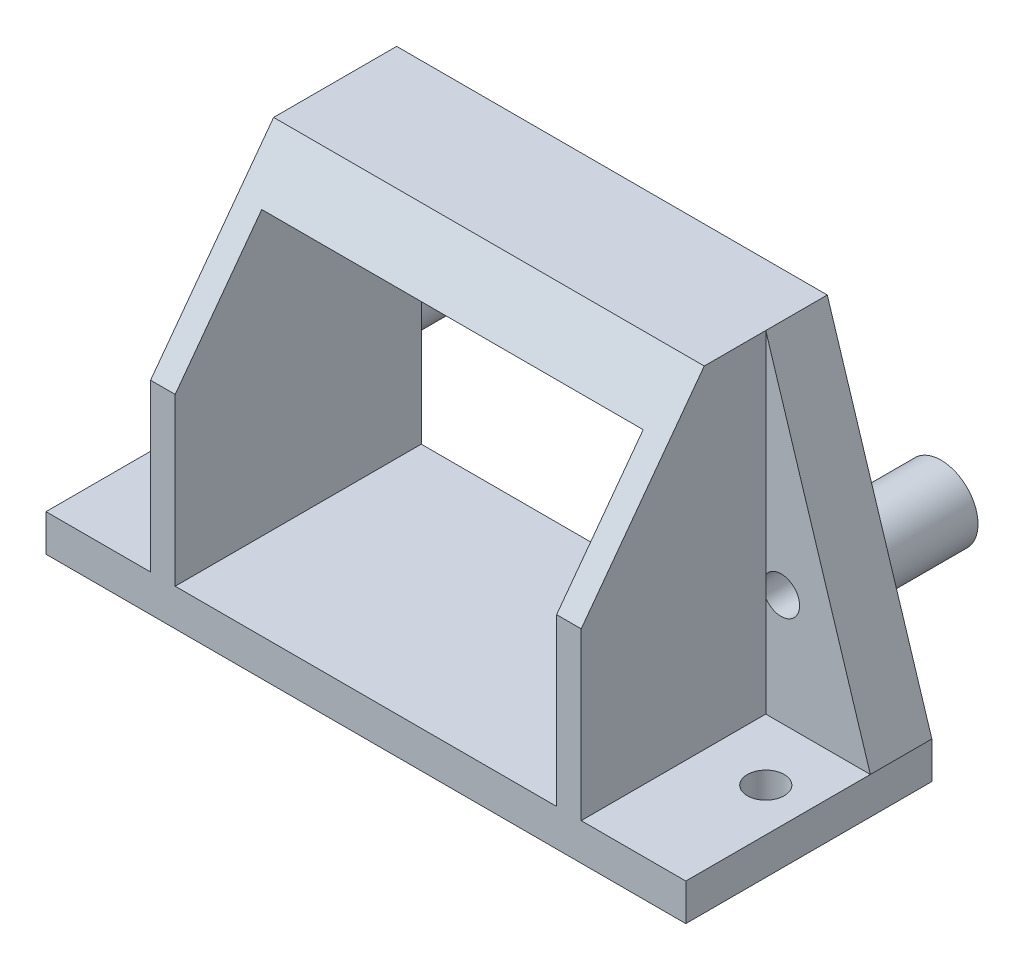
ISO-10303-21;
HEADER;
FILE_DESCRIPTION(('STEP AP214'),'2;1');
FILE_NAME('part.step','',(''),(''),'','','');
FILE_SCHEMA(('AUTOMOTIVE_DESIGN { 1 0 10303 214 1 1 1 1 }'));
ENDSEC;
DATA;
#1=APPLICATION_CONTEXT('core data for automotive mechanical design processes');
#2=APPLICATION_PROTOCOL_DEFINITION('international standard','automotive_design',2000,#1);
#3=PRODUCT_CONTEXT('',#1,'mechanical');
#4=PRODUCT('Part','Part','',(#3));
#5=PRODUCT_RELATED_PRODUCT_CATEGORY('part','',(#4));
#6=PRODUCT_DEFINITION_FORMATION('','',#4);
#7=PRODUCT_DEFINITION_CONTEXT('part definition',#1,'design');
#8=PRODUCT_DEFINITION('design','',#6,#7);
#9=PRODUCT_DEFINITION_SHAPE('','',#8);
#10=(LENGTH_UNIT() NAMED_UNIT(*) SI_UNIT(.MILLI.,.METRE.));
#11=(NAMED_UNIT(*) PLANE_ANGLE_UNIT() SI_UNIT($,.RADIAN.));
#12=(NAMED_UNIT(*) SI_UNIT($,.STERADIAN.) SOLID_ANGLE_UNIT());
#13=UNCERTAINTY_MEASURE_WITH_UNIT(LENGTH_MEASURE(1.E-05),#10,'distance_accuracy_value','');
#14=(GEOMETRIC_REPRESENTATION_CONTEXT(3) GLOBAL_UNCERTAINTY_ASSIGNED_CONTEXT((#13)) GLOBAL_UNIT_ASSIGNED_CONTEXT((#10,
#11,#12)) REPRESENTATION_CONTEXT('',''));
#15=CARTESIAN_POINT('',(0.,0.,0.));
#16=DIRECTION('',(0.,0.,1.));
#17=DIRECTION('',(1.,0.,0.));
#18=AXIS2_PLACEMENT_3D('',#15,#16,#17);
#19=CARTESIAN_POINT('',(0.,0.,0.));
#20=DIRECTION('',(0.,0.,1.));
#21=DIRECTION('',(1.,0.,0.));
#22=AXIS2_PLACEMENT_3D('',#19,#20,#21);
#23=PLANE('',#22);
#24=CARTESIAN_POINT('',(-18.75,12.,0.));
#25=DIRECTION('',(0.,0.,1.));
#26=DIRECTION('',(1.,0.,0.));
#27=AXIS2_PLACEMENT_3D('',#24,#25,#26);
#28=CIRCLE('',#27,3.);
#29=CARTESIAN_POINT('',(-15.75,12.,0.));
#30=VERTEX_POINT('',#29);
#31=EDGE_CURVE('E41',#30,#30,#28,.F.);
#32=ORIENTED_EDGE('',*,*,#31,.F.);
#33=EDGE_LOOP('',(#32));
#34=FACE_BOUND('',#33,.T.);
#35=DIRECTION('',(-0.30028587523271,0.953849250739196,0.));
#36=VECTOR('',#35,1.);
#37=CARTESIAN_POINT('',(17.5,30.,0.));
#38=LINE('',#37,#36);
#39=CARTESIAN_POINT('',(26.,3.,0.));
#40=VERTEX_POINT('',#39);
#41=CARTESIAN_POINT('',(17.5,30.,0.));
#42=VERTEX_POINT('',#41);
#43=EDGE_CURVE('E409',#40,#42,#38,.T.);
#44=ORIENTED_EDGE('',*,*,#43,.F.);
#45=DIRECTION('',(0.,1.,0.));
#46=VECTOR('',#45,1.);
#47=CARTESIAN_POINT('',(26.,0.,0.));
#48=LINE('',#47,#46);
#49=CARTESIAN_POINT('',(26.,0.,0.));
#50=VERTEX_POINT('',#49);
#51=EDGE_CURVE('E413',#50,#40,#48,.T.);
#52=ORIENTED_EDGE('',*,*,#51,.F.);
#53=DIRECTION('',(1.,0.,0.));
#54=VECTOR('',#53,1.);
#55=CARTESIAN_POINT('',(-26.,0.,0.));
#56=LINE('',#55,#54);
#57=CARTESIAN_POINT('',(-26.,0.,0.));
#58=VERTEX_POINT('',#57);
#59=EDGE_CURVE('E428',#58,#50,#56,.T.);
#60=ORIENTED_EDGE('',*,*,#59,.F.);
#61=DIRECTION('',(0.,-1.,0.));
#62=VECTOR('',#61,1.);
#63=CARTESIAN_POINT('',(-26.,3.,0.));
#64=LINE('',#63,#62);
#65=CARTESIAN_POINT('',(-26.,3.,0.));
#66=VERTEX_POINT('',#65);
#67=EDGE_CURVE('E426',#66,#58,#64,.T.);
#68=ORIENTED_EDGE('',*,*,#67,.F.);
#69=DIRECTION('',(-0.30028587523271,-0.953849250739196,0.));
#70=VECTOR('',#69,1.);
#71=CARTESIAN_POINT('',(-26.,3.,0.));
#72=LINE('',#71,#70);
#73=CARTESIAN_POINT('',(-17.5,30.,0.));
#74=VERTEX_POINT('',#73);
#75=EDGE_CURVE('E423',#74,#66,#72,.T.);
#76=ORIENTED_EDGE('',*,*,#75,.F.);
#77=DIRECTION('',(-1.,0.,0.));
#78=VECTOR('',#77,1.);
#79=CARTESIAN_POINT('',(17.5,30.,0.));
#80=LINE('',#79,#78);
#81=EDGE_CURVE('E421',#42,#74,#80,.T.);
#82=ORIENTED_EDGE('',*,*,#81,.F.);
#83=EDGE_LOOP('',(#44,#52,#60,#68,#76,#82));
#84=FACE_BOUND('',#83,.T.);
#85=DIRECTION('',(1.,0.,0.));
#86=VECTOR('',#85,1.);
#87=CARTESIAN_POINT('',(-15.5,3.,0.));
#88=LINE('',#87,#86);
#89=CARTESIAN_POINT('',(-15.5,3.,0.));
#90=VERTEX_POINT('',#89);
#91=CARTESIAN_POINT('',(15.5,3.,0.));
#92=VERTEX_POINT('',#91);
#93=EDGE_CURVE('E374',#90,#92,#88,.T.);
#94=ORIENTED_EDGE('',*,*,#93,.T.);
#95=DIRECTION('',(0.,1.,0.));
#96=VECTOR('',#95,1.);
#97=CARTESIAN_POINT('',(15.5,26.,0.));
#98=LINE('',#97,#96);
#99=CARTESIAN_POINT('',(15.5,26.,0.));
#100=VERTEX_POINT('',#99);
#101=EDGE_CURVE('E383',#92,#100,#98,.T.);
#102=ORIENTED_EDGE('',*,*,#101,.T.);
#103=DIRECTION('',(-1.,0.,0.));
#104=VECTOR('',#103,1.);
#105=CARTESIAN_POINT('',(-15.5,26.,0.));
#106=LINE('',#105,#104);
#107=CARTESIAN_POINT('',(-15.5,26.,0.));
#108=VERTEX_POINT('',#107);
#109=EDGE_CURVE('E397',#100,#108,#106,.T.);
#110=ORIENTED_EDGE('',*,*,#109,.T.);
#111=DIRECTION('',(0.,-1.,0.));
#112=VECTOR('',#111,1.);
#113=CARTESIAN_POINT('',(-15.5,3.,0.));
#114=LINE('',#113,#112);
#115=EDGE_CURVE('E389',#108,#90,#114,.T.);
#116=ORIENTED_EDGE('',*,*,#115,.T.);
#117=EDGE_LOOP('',(#94,#102,#110,#116));
#118=FACE_BOUND('',#117,.T.);
#119=CARTESIAN_POINT('',(18.75,12.,0.));
#120=DIRECTION('',(0.,0.,1.));
#121=DIRECTION('',(1.,0.,0.));
#122=AXIS2_PLACEMENT_3D('',#119,#120,#121);
#123=CIRCLE('',#122,3.);
#124=CARTESIAN_POINT('',(21.75,12.,0.));
#125=VERTEX_POINT('',#124);
#126=EDGE_CURVE('E11',#125,#125,#123,.F.);
#127=ORIENTED_EDGE('',*,*,#126,.F.);
#128=EDGE_LOOP('',(#127));
#129=FACE_BOUND('',#128,.T.);
#130=ADVANCED_FACE('F33',(#34,#84,#118,#129),#23,.F.);
#131=CARTESIAN_POINT('',(0.,0.,20.));
#132=DIRECTION('',(0.,0.,1.));
#133=DIRECTION('',(1.,0.,0.));
#134=AXIS2_PLACEMENT_3D('',#131,#132,#133);
#135=PLANE('',#134);
#136=DIRECTION('',(0.,1.,0.));
#137=VECTOR('',#136,1.);
#138=CARTESIAN_POINT('',(-17.5,3.,20.));
#139=LINE('',#138,#137);
#140=CARTESIAN_POINT('',(-17.5,3.,20.));
#141=VERTEX_POINT('',#140);
#142=CARTESIAN_POINT('',(-17.5,16.5,20.));
#143=VERTEX_POINT('',#142);
#144=EDGE_CURVE('E197',#141,#143,#139,.T.);
#145=ORIENTED_EDGE('',*,*,#144,.F.);
#146=DIRECTION('',(1.,0.,0.));
#147=VECTOR('',#146,1.);
#148=CARTESIAN_POINT('',(-26.,3.,20.));
#149=LINE('',#148,#147);
#150=CARTESIAN_POINT('',(-26.,3.,20.));
#151=VERTEX_POINT('',#150);
#152=EDGE_CURVE('E193',#151,#141,#149,.T.);
#153=ORIENTED_EDGE('',*,*,#152,.F.);
#154=DIRECTION('',(0.,-1.,0.));
#155=VECTOR('',#154,1.);
#156=CARTESIAN_POINT('',(-26.,3.,20.));
#157=LINE('',#156,#155);
#158=CARTESIAN_POINT('',(-26.,0.,20.));
#159=VERTEX_POINT('',#158);
#160=EDGE_CURVE('E410',#151,#159,#157,.T.);
#161=ORIENTED_EDGE('',*,*,#160,.T.);
#162=DIRECTION('',(1.,0.,0.));
#163=VECTOR('',#162,1.);
#164=CARTESIAN_POINT('',(-26.,0.,20.));
#165=LINE('',#164,#163);
#166=CARTESIAN_POINT('',(26.,0.,20.));
#167=VERTEX_POINT('',#166);
#168=EDGE_CURVE('E412',#159,#167,#165,.T.);
#169=ORIENTED_EDGE('',*,*,#168,.T.);
#170=DIRECTION('',(0.,1.,0.));
#171=VECTOR('',#170,1.);
#172=CARTESIAN_POINT('',(26.,0.,20.));
#173=LINE('',#172,#171);
#174=CARTESIAN_POINT('',(26.,3.,20.));
#175=VERTEX_POINT('',#174);
#176=EDGE_CURVE('E415',#167,#175,#173,.T.);
#177=ORIENTED_EDGE('',*,*,#176,.T.);
#178=DIRECTION('',(1.,0.,0.));
#179=VECTOR('',#178,1.);
#180=CARTESIAN_POINT('',(17.5,3.,20.));
#181=LINE('',#180,#179);
#182=CARTESIAN_POINT('',(17.5,3.,20.));
#183=VERTEX_POINT('',#182);
#184=EDGE_CURVE('E186',#183,#175,#181,.T.);
#185=ORIENTED_EDGE('',*,*,#184,.F.);
#186=DIRECTION('',(0.,-1.,0.));
#187=VECTOR('',#186,1.);
#188=CARTESIAN_POINT('',(17.5,30.,20.));
#189=LINE('',#188,#187);
#190=CARTESIAN_POINT('',(17.5,16.5,20.));
#191=VERTEX_POINT('',#190);
#192=EDGE_CURVE('E187',#191,#183,#189,.T.);
#193=ORIENTED_EDGE('',*,*,#192,.F.);
#194=DIRECTION('',(1.,0.,0.));
#195=VECTOR('',#194,1.);
#196=CARTESIAN_POINT('',(-61.5,16.5,20.));
#197=LINE('',#196,#195);
#198=CARTESIAN_POINT('',(15.5,16.5,20.));
#199=VERTEX_POINT('',#198);
#200=EDGE_CURVE('E457',#199,#191,#197,.T.);
#201=ORIENTED_EDGE('',*,*,#200,.F.);
#202=DIRECTION('',(0.,1.,0.));
#203=VECTOR('',#202,1.);
#204=CARTESIAN_POINT('',(15.5,26.,20.));
#205=LINE('',#204,#203);
#206=CARTESIAN_POINT('',(15.5,3.,20.));
#207=VERTEX_POINT('',#206);
#208=EDGE_CURVE('E400',#207,#199,#205,.T.);
#209=ORIENTED_EDGE('',*,*,#208,.F.);
#210=DIRECTION('',(1.,0.,0.));
#211=VECTOR('',#210,1.);
#212=CARTESIAN_POINT('',(-15.5,3.,20.));
#213=LINE('',#212,#211);
#214=CARTESIAN_POINT('',(-15.5,3.,20.));
#215=VERTEX_POINT('',#214);
#216=EDGE_CURVE('E398',#215,#207,#213,.T.);
#217=ORIENTED_EDGE('',*,*,#216,.F.);
#218=DIRECTION('',(0.,-1.,0.));
#219=VECTOR('',#218,1.);
#220=CARTESIAN_POINT('',(-15.5,3.,20.));
#221=LINE('',#220,#219);
#222=CARTESIAN_POINT('',(-15.5,16.5,20.));
#223=VERTEX_POINT('',#222);
#224=EDGE_CURVE('E392',#223,#215,#221,.T.);
#225=ORIENTED_EDGE('',*,*,#224,.F.);
#226=EDGE_CURVE('E451',#143,#223,#197,.T.);
#227=ORIENTED_EDGE('',*,*,#226,.F.);
#228=EDGE_LOOP('',(#145,#153,#161,#169,#177,#185,#193,#201,#209,#217,#225,#227));
#229=FACE_BOUND('',#228,.T.);
#230=ADVANCED_FACE('F245',(#229),#135,.T.);
#231=CARTESIAN_POINT('',(17.5,30.,20.));
#232=DIRECTION('',(-0.953849250739196,-0.30028587523271,0.));
#233=DIRECTION('',(0.30028587523271,-0.953849250739196,0.));
#234=AXIS2_PLACEMENT_3D('',#231,#232,#233);
#235=PLANE('',#234);
#236=DIRECTION('',(0.,0.,-1.));
#237=VECTOR('',#236,1.);
#238=CARTESIAN_POINT('',(17.5,30.,20.));
#239=LINE('',#238,#237);
#240=CARTESIAN_POINT('',(17.5,30.,4.99999999999995));
#241=VERTEX_POINT('',#240);
#242=EDGE_CURVE('E293',#241,#42,#239,.T.);
#243=ORIENTED_EDGE('',*,*,#242,.F.);
#244=DIRECTION('',(-0.30028587523271,0.953849250739196,0.));
#245=VECTOR('',#244,1.);
#246=CARTESIAN_POINT('',(26.,3.,4.99999999999995));
#247=LINE('',#246,#245);
#248=CARTESIAN_POINT('',(26.,3.,4.99999999999995));
#249=VERTEX_POINT('',#248);
#250=EDGE_CURVE('E180',#249,#241,#247,.T.);
#251=ORIENTED_EDGE('',*,*,#250,.F.);
#252=DIRECTION('',(0.,0.,-1.));
#253=VECTOR('',#252,1.);
#254=CARTESIAN_POINT('',(26.,3.,20.));
#255=LINE('',#254,#253);
#256=EDGE_CURVE('E418',#249,#40,#255,.T.);
#257=ORIENTED_EDGE('',*,*,#256,.T.);
#258=ORIENTED_EDGE('',*,*,#43,.T.);
#259=EDGE_LOOP('',(#243,#251,#257,#258));
#260=FACE_BOUND('',#259,.T.);
#261=ADVANCED_FACE('F35',(#260),#235,.F.);
#262=CARTESIAN_POINT('',(17.5,30.,20.));
#263=DIRECTION('',(0.,-1.,0.));
#264=DIRECTION('',(1.,0.,0.));
#265=AXIS2_PLACEMENT_3D('',#262,#263,#264);
#266=PLANE('',#265);
#267=DIRECTION('',(0.,0.,-1.));
#268=VECTOR('',#267,1.);
#269=CARTESIAN_POINT('',(-17.5,30.,20.));
#270=LINE('',#269,#268);
#271=CARTESIAN_POINT('',(-17.5,30.,10.));
#272=VERTEX_POINT('',#271);
#273=CARTESIAN_POINT('',(-17.5,30.,4.99999999999995));
#274=VERTEX_POINT('',#273);
#275=EDGE_CURVE('E284',#272,#274,#270,.T.);
#276=ORIENTED_EDGE('',*,*,#275,.F.);
#277=DIRECTION('',(1.,0.,0.));
#278=VECTOR('',#277,1.);
#279=CARTESIAN_POINT('',(-61.5,30.,10.));
#280=LINE('',#279,#278);
#281=CARTESIAN_POINT('',(17.5,30.,10.));
#282=VERTEX_POINT('',#281);
#283=EDGE_CURVE('E287',#272,#282,#280,.T.);
#284=ORIENTED_EDGE('',*,*,#283,.T.);
#285=EDGE_CURVE('E295',#282,#241,#239,.T.);
#286=ORIENTED_EDGE('',*,*,#285,.T.);
#287=ORIENTED_EDGE('',*,*,#242,.T.);
#288=ORIENTED_EDGE('',*,*,#81,.T.);
#289=EDGE_CURVE('E289',#274,#74,#270,.T.);
#290=ORIENTED_EDGE('',*,*,#289,.F.);
#291=EDGE_LOOP('',(#276,#284,#286,#287,#288,#290));
#292=FACE_BOUND('',#291,.T.);
#293=ADVANCED_FACE('F272',(#292),#266,.F.);
#294=CARTESIAN_POINT('',(-26.,3.,20.));
#295=DIRECTION('',(0.953849250739196,-0.30028587523271,0.));
#296=DIRECTION('',(0.30028587523271,0.953849250739196,0.));
#297=AXIS2_PLACEMENT_3D('',#294,#295,#296);
#298=PLANE('',#297);
#299=DIRECTION('',(0.,0.,-1.));
#300=VECTOR('',#299,1.);
#301=CARTESIAN_POINT('',(-26.,3.,20.));
#302=LINE('',#301,#300);
#303=CARTESIAN_POINT('',(-26.,3.,4.99999999999995));
#304=VERTEX_POINT('',#303);
#305=EDGE_CURVE('E438',#304,#66,#302,.T.);
#306=ORIENTED_EDGE('',*,*,#305,.F.);
#307=DIRECTION('',(-0.30028587523271,-0.953849250739196,0.));
#308=VECTOR('',#307,1.);
#309=CARTESIAN_POINT('',(-17.5,30.,4.99999999999995));
#310=LINE('',#309,#308);
#311=EDGE_CURVE('E202',#274,#304,#310,.T.);
#312=ORIENTED_EDGE('',*,*,#311,.F.);
#313=ORIENTED_EDGE('',*,*,#289,.T.);
#314=ORIENTED_EDGE('',*,*,#75,.T.);
#315=EDGE_LOOP('',(#306,#312,#313,#314));
#316=FACE_BOUND('',#315,.T.);
#317=ADVANCED_FACE('F269',(#316),#298,.F.);
#318=CARTESIAN_POINT('',(-26.,3.,20.));
#319=DIRECTION('',(1.,0.,0.));
#320=DIRECTION('',(0.,1.,0.));
#321=AXIS2_PLACEMENT_3D('',#318,#319,#320);
#322=PLANE('',#321);
#323=ORIENTED_EDGE('',*,*,#67,.T.);
#324=DIRECTION('',(0.,0.,-1.));
#325=VECTOR('',#324,1.);
#326=CARTESIAN_POINT('',(-26.,0.,20.));
#327=LINE('',#326,#325);
#328=EDGE_CURVE('E436',#159,#58,#327,.T.);
#329=ORIENTED_EDGE('',*,*,#328,.F.);
#330=ORIENTED_EDGE('',*,*,#160,.F.);
#331=EDGE_CURVE('E297',#151,#304,#302,.T.);
#332=ORIENTED_EDGE('',*,*,#331,.T.);
#333=ORIENTED_EDGE('',*,*,#305,.T.);
#334=EDGE_LOOP('',(#323,#329,#330,#332,#333));
#335=FACE_BOUND('',#334,.T.);
#336=ADVANCED_FACE('F265',(#335),#322,.F.);
#337=CARTESIAN_POINT('',(-26.,0.,20.));
#338=DIRECTION('',(0.,1.,0.));
#339=DIRECTION('',(0.,0.,1.));
#340=AXIS2_PLACEMENT_3D('',#337,#338,#339);
#341=PLANE('',#340);
#342=CARTESIAN_POINT('',(22.5,0.,10.));
#343=DIRECTION('',(0.,-1.,0.));
#344=DIRECTION('',(0.,0.,-1.));
#345=AXIS2_PLACEMENT_3D('',#342,#343,#344);
#346=CIRCLE('',#345,1.5);
#347=CARTESIAN_POINT('',(22.5,0.,8.5));
#348=VERTEX_POINT('',#347);
#349=EDGE_CURVE('E212',#348,#348,#346,.T.);
#350=ORIENTED_EDGE('',*,*,#349,.F.);
#351=EDGE_LOOP('',(#350));
#352=FACE_BOUND('',#351,.T.);
#353=CARTESIAN_POINT('',(-22.5,0.,10.));
#354=DIRECTION('',(0.,-1.,0.));
#355=DIRECTION('',(0.,0.,-1.));
#356=AXIS2_PLACEMENT_3D('',#353,#354,#355);
#357=CIRCLE('',#356,1.5);
#358=CARTESIAN_POINT('',(-22.5,0.,8.5));
#359=VERTEX_POINT('',#358);
#360=EDGE_CURVE('E208',#359,#359,#357,.T.);
#361=ORIENTED_EDGE('',*,*,#360,.F.);
#362=EDGE_LOOP('',(#361));
#363=FACE_BOUND('',#362,.T.);
#364=ORIENTED_EDGE('',*,*,#59,.T.);
#365=DIRECTION('',(0.,0.,-1.));
#366=VECTOR('',#365,1.);
#367=CARTESIAN_POINT('',(26.,0.,20.));
#368=LINE('',#367,#366);
#369=EDGE_CURVE('E434',#167,#50,#368,.T.);
#370=ORIENTED_EDGE('',*,*,#369,.F.);
#371=ORIENTED_EDGE('',*,*,#168,.F.);
#372=ORIENTED_EDGE('',*,*,#328,.T.);
#373=EDGE_LOOP('',(#364,#370,#371,#372));
#374=FACE_BOUND('',#373,.T.);
#375=ADVANCED_FACE('F261',(#352,#363,#374),#341,.F.);
#376=CARTESIAN_POINT('',(26.,0.,20.));
#377=DIRECTION('',(-1.,0.,0.));
#378=DIRECTION('',(0.,0.,1.));
#379=AXIS2_PLACEMENT_3D('',#376,#377,#378);
#380=PLANE('',#379);
#381=ORIENTED_EDGE('',*,*,#51,.T.);
#382=ORIENTED_EDGE('',*,*,#256,.F.);
#383=EDGE_CURVE('E432',#175,#249,#255,.T.);
#384=ORIENTED_EDGE('',*,*,#383,.F.);
#385=ORIENTED_EDGE('',*,*,#176,.F.);
#386=ORIENTED_EDGE('',*,*,#369,.T.);
#387=EDGE_LOOP('',(#381,#382,#384,#385,#386));
#388=FACE_BOUND('',#387,.T.);
#389=ADVANCED_FACE('F257',(#388),#380,.F.);
#390=CARTESIAN_POINT('',(-15.5,3.,20.));
#391=DIRECTION('',(0.,1.,0.));
#392=DIRECTION('',(-1.,0.,0.));
#393=AXIS2_PLACEMENT_3D('',#390,#391,#392);
#394=PLANE('',#393);
#395=ORIENTED_EDGE('',*,*,#93,.F.);
#396=DIRECTION('',(0.,0.,-1.));
#397=VECTOR('',#396,1.);
#398=CARTESIAN_POINT('',(-15.5,3.,20.));
#399=LINE('',#398,#397);
#400=EDGE_CURVE('E376',#215,#90,#399,.T.);
#401=ORIENTED_EDGE('',*,*,#400,.F.);
#402=ORIENTED_EDGE('',*,*,#216,.T.);
#403=DIRECTION('',(0.,0.,-1.));
#404=VECTOR('',#403,1.);
#405=CARTESIAN_POINT('',(15.5,3.,20.));
#406=LINE('',#405,#404);
#407=EDGE_CURVE('E379',#207,#92,#406,.T.);
#408=ORIENTED_EDGE('',*,*,#407,.T.);
#409=EDGE_LOOP('',(#395,#401,#402,#408));
#410=FACE_BOUND('',#409,.T.);
#411=ADVANCED_FACE('F260',(#410),#394,.T.);
#412=CARTESIAN_POINT('',(15.5,26.,20.));
#413=DIRECTION('',(-1.,0.,0.));
#414=DIRECTION('',(0.,0.,1.));
#415=AXIS2_PLACEMENT_3D('',#412,#413,#414);
#416=PLANE('',#415);
#417=DIRECTION('',(0.,-0.803557193344746,0.595227550625738));
#418=VECTOR('',#417,1.);
#419=CARTESIAN_POINT('',(15.5,22.6341895482728,15.4561558901683));
#420=LINE('',#419,#418);
#421=CARTESIAN_POINT('',(15.5,26.,12.962962962963));
#422=VERTEX_POINT('',#421);
#423=EDGE_CURVE('E384',#422,#199,#420,.T.);
#424=ORIENTED_EDGE('',*,*,#423,.F.);
#425=DIRECTION('',(0.,0.,-1.));
#426=VECTOR('',#425,1.);
#427=CARTESIAN_POINT('',(15.5,26.,20.));
#428=LINE('',#427,#426);
#429=EDGE_CURVE('E406',#422,#100,#428,.T.);
#430=ORIENTED_EDGE('',*,*,#429,.T.);
#431=ORIENTED_EDGE('',*,*,#101,.F.);
#432=ORIENTED_EDGE('',*,*,#407,.F.);
#433=ORIENTED_EDGE('',*,*,#208,.T.);
#434=EDGE_LOOP('',(#424,#430,#431,#432,#433));
#435=FACE_BOUND('',#434,.T.);
#436=ADVANCED_FACE('F363',(#435),#416,.T.);
#437=CARTESIAN_POINT('',(-15.5,26.,20.));
#438=DIRECTION('',(0.,-1.,0.));
#439=DIRECTION('',(0.,0.,-1.));
#440=AXIS2_PLACEMENT_3D('',#437,#438,#439);
#441=PLANE('',#440);
#442=DIRECTION('',(1.,0.,0.));
#443=VECTOR('',#442,1.);
#444=CARTESIAN_POINT('',(-15.5,26.,12.962962962963));
#445=LINE('',#444,#443);
#446=CARTESIAN_POINT('',(-15.5,26.,12.962962962963));
#447=VERTEX_POINT('',#446);
#448=EDGE_CURVE('E454',#447,#422,#445,.T.);
#449=ORIENTED_EDGE('',*,*,#448,.F.);
#450=DIRECTION('',(0.,0.,-1.));
#451=VECTOR('',#450,1.);
#452=CARTESIAN_POINT('',(-15.5,26.,20.));
#453=LINE('',#452,#451);
#454=EDGE_CURVE('E393',#447,#108,#453,.T.);
#455=ORIENTED_EDGE('',*,*,#454,.T.);
#456=ORIENTED_EDGE('',*,*,#109,.F.);
#457=ORIENTED_EDGE('',*,*,#429,.F.);
#458=EDGE_LOOP('',(#449,#455,#456,#457));
#459=FACE_BOUND('',#458,.T.);
#460=ADVANCED_FACE('F359',(#459),#441,.T.);
#461=CARTESIAN_POINT('',(-15.5,3.,20.));
#462=DIRECTION('',(1.,0.,0.));
#463=DIRECTION('',(0.,0.,-1.));
#464=AXIS2_PLACEMENT_3D('',#461,#462,#463);
#465=PLANE('',#464);
#466=DIRECTION('',(0.,0.803557193344746,-0.595227550625738));
#467=VECTOR('',#466,1.);
#468=CARTESIAN_POINT('',(-15.5,7.78299379982285,26.4570416297609));
#469=LINE('',#468,#467);
#470=EDGE_CURVE('E301',#223,#447,#469,.T.);
#471=ORIENTED_EDGE('',*,*,#470,.F.);
#472=ORIENTED_EDGE('',*,*,#224,.T.);
#473=ORIENTED_EDGE('',*,*,#400,.T.);
#474=ORIENTED_EDGE('',*,*,#115,.F.);
#475=ORIENTED_EDGE('',*,*,#454,.F.);
#476=EDGE_LOOP('',(#471,#472,#473,#474,#475));
#477=FACE_BOUND('',#476,.T.);
#478=ADVANCED_FACE('F355',(#477),#465,.T.);
#479=CARTESIAN_POINT('',(-61.5,16.5,20.));
#480=DIRECTION('',(0.,-0.595227550625738,-0.803557193344746));
#481=DIRECTION('',(0.,0.803557193344746,-0.595227550625738));
#482=AXIS2_PLACEMENT_3D('',#479,#480,#481);
#483=PLANE('',#482);
#484=ORIENTED_EDGE('',*,*,#283,.F.);
#485=DIRECTION('',(0.,-0.803557193344746,0.595227550625738));
#486=VECTOR('',#485,1.);
#487=CARTESIAN_POINT('',(-17.5,16.5,20.));
#488=LINE('',#487,#486);
#489=EDGE_CURVE('E162',#272,#143,#488,.T.);
#490=ORIENTED_EDGE('',*,*,#489,.T.);
#491=ORIENTED_EDGE('',*,*,#226,.T.);
#492=ORIENTED_EDGE('',*,*,#470,.T.);
#493=ORIENTED_EDGE('',*,*,#448,.T.);
#494=ORIENTED_EDGE('',*,*,#423,.T.);
#495=ORIENTED_EDGE('',*,*,#200,.T.);
#496=DIRECTION('',(0.,0.803557193344746,-0.595227550625738));
#497=VECTOR('',#496,1.);
#498=CARTESIAN_POINT('',(17.5,16.5,20.));
#499=LINE('',#498,#497);
#500=EDGE_CURVE('E303',#191,#282,#499,.T.);
#501=ORIENTED_EDGE('',*,*,#500,.T.);
#502=EDGE_LOOP('',(#484,#490,#491,#492,#493,#494,#495,#501));
#503=FACE_BOUND('',#502,.T.);
#504=ADVANCED_FACE('F352',(#503),#483,.F.);
#505=CARTESIAN_POINT('',(17.5,30.,4.99999999999995));
#506=DIRECTION('',(-1.,0.,0.));
#507=DIRECTION('',(0.,0.,1.));
#508=AXIS2_PLACEMENT_3D('',#505,#506,#507);
#509=PLANE('',#508);
#510=ORIENTED_EDGE('',*,*,#192,.T.);
#511=DIRECTION('',(0.,0.,1.));
#512=VECTOR('',#511,1.);
#513=CARTESIAN_POINT('',(17.5,3.,4.99999999999995));
#514=LINE('',#513,#512);
#515=CARTESIAN_POINT('',(17.5,3.,4.99999999999995));
#516=VERTEX_POINT('',#515);
#517=EDGE_CURVE('E183',#516,#183,#514,.T.);
#518=ORIENTED_EDGE('',*,*,#517,.F.);
#519=DIRECTION('',(0.,-1.,0.));
#520=VECTOR('',#519,1.);
#521=CARTESIAN_POINT('',(17.5,30.,4.99999999999995));
#522=LINE('',#521,#520);
#523=CARTESIAN_POINT('',(17.5,11.1708438024112,4.99999999999995));
#524=VERTEX_POINT('',#523);
#525=EDGE_CURVE('E175',#524,#516,#522,.T.);
#526=ORIENTED_EDGE('',*,*,#525,.F.);
#527=CARTESIAN_POINT('',(17.5,12.8291561975888,4.99999999999995));
#528=VERTEX_POINT('',#527);
#529=EDGE_CURVE('E167',#528,#524,#522,.T.);
#530=ORIENTED_EDGE('',*,*,#529,.F.);
#531=EDGE_CURVE('E172',#241,#528,#522,.T.);
#532=ORIENTED_EDGE('',*,*,#531,.F.);
#533=ORIENTED_EDGE('',*,*,#285,.F.);
#534=ORIENTED_EDGE('',*,*,#500,.F.);
#535=EDGE_LOOP('',(#510,#518,#526,#530,#532,#533,#534));
#536=FACE_BOUND('',#535,.T.);
#537=ADVANCED_FACE('F171',(#536),#509,.F.);
#538=CARTESIAN_POINT('',(17.5,3.,4.99999999999995));
#539=DIRECTION('',(0.,-1.,0.));
#540=DIRECTION('',(0.,0.,-1.));
#541=AXIS2_PLACEMENT_3D('',#538,#539,#540);
#542=PLANE('',#541);
#543=CARTESIAN_POINT('',(22.5,3.,10.));
#544=DIRECTION('',(0.,-1.,0.));
#545=DIRECTION('',(0.,0.,-1.));
#546=AXIS2_PLACEMENT_3D('',#543,#544,#545);
#547=CIRCLE('',#546,1.5);
#548=CARTESIAN_POINT('',(22.5,3.,8.5));
#549=VERTEX_POINT('',#548);
#550=EDGE_CURVE('E211',#549,#549,#547,.T.);
#551=ORIENTED_EDGE('',*,*,#550,.T.);
#552=EDGE_LOOP('',(#551));
#553=FACE_BOUND('',#552,.T.);
#554=ORIENTED_EDGE('',*,*,#184,.T.);
#555=ORIENTED_EDGE('',*,*,#383,.T.);
#556=DIRECTION('',(1.,0.,0.));
#557=VECTOR('',#556,1.);
#558=CARTESIAN_POINT('',(17.5,3.,4.99999999999995));
#559=LINE('',#558,#557);
#560=EDGE_CURVE('E182',#516,#249,#559,.T.);
#561=ORIENTED_EDGE('',*,*,#560,.F.);
#562=ORIENTED_EDGE('',*,*,#517,.T.);
#563=EDGE_LOOP('',(#554,#555,#561,#562));
#564=FACE_BOUND('',#563,.T.);
#565=ADVANCED_FACE('F315',(#553,#564),#542,.F.);
#566=CARTESIAN_POINT('',(0.,0.,4.99999999999995));
#567=DIRECTION('',(0.,0.,-1.));
#568=DIRECTION('',(-1.,0.,0.));
#569=AXIS2_PLACEMENT_3D('',#566,#567,#568);
#570=PLANE('',#569);
#571=ORIENTED_EDGE('',*,*,#531,.T.);
#572=CARTESIAN_POINT('',(18.75,12.,4.99999999999995));
#573=DIRECTION('',(0.,0.,-1.));
#574=DIRECTION('',(-1.,0.,0.));
#575=AXIS2_PLACEMENT_3D('',#572,#573,#574);
#576=CIRCLE('',#575,1.5);
#577=EDGE_CURVE('E156',#528,#524,#576,.T.);
#578=ORIENTED_EDGE('',*,*,#577,.T.);
#579=ORIENTED_EDGE('',*,*,#525,.T.);
#580=ORIENTED_EDGE('',*,*,#560,.T.);
#581=ORIENTED_EDGE('',*,*,#250,.T.);
#582=EDGE_LOOP('',(#571,#578,#579,#580,#581));
#583=FACE_BOUND('',#582,.T.);
#584=ADVANCED_FACE('F177',(#583),#570,.F.);
#585=CARTESIAN_POINT('',(-17.5,3.,4.99999999999995));
#586=DIRECTION('',(1.,0.,0.));
#587=DIRECTION('',(0.,0.,-1.));
#588=AXIS2_PLACEMENT_3D('',#585,#586,#587);
#589=PLANE('',#588);
#590=ORIENTED_EDGE('',*,*,#275,.T.);
#591=DIRECTION('',(0.,1.,0.));
#592=VECTOR('',#591,1.);
#593=CARTESIAN_POINT('',(-17.5,3.,4.99999999999995));
#594=LINE('',#593,#592);
#595=CARTESIAN_POINT('',(-17.5,12.8291561975888,4.99999999999995));
#596=VERTEX_POINT('',#595);
#597=EDGE_CURVE('E196',#596,#274,#594,.T.);
#598=ORIENTED_EDGE('',*,*,#597,.F.);
#599=CARTESIAN_POINT('',(-17.5,11.1708438024112,4.99999999999995));
#600=VERTEX_POINT('',#599);
#601=EDGE_CURVE('E207',#600,#596,#594,.T.);
#602=ORIENTED_EDGE('',*,*,#601,.F.);
#603=CARTESIAN_POINT('',(-17.5,3.,4.99999999999995));
#604=VERTEX_POINT('',#603);
#605=EDGE_CURVE('E204',#604,#600,#594,.T.);
#606=ORIENTED_EDGE('',*,*,#605,.F.);
#607=DIRECTION('',(0.,0.,1.));
#608=VECTOR('',#607,1.);
#609=CARTESIAN_POINT('',(-17.5,3.,4.99999999999995));
#610=LINE('',#609,#608);
#611=EDGE_CURVE('E190',#604,#141,#610,.T.);
#612=ORIENTED_EDGE('',*,*,#611,.T.);
#613=ORIENTED_EDGE('',*,*,#144,.T.);
#614=ORIENTED_EDGE('',*,*,#489,.F.);
#615=EDGE_LOOP('',(#590,#598,#602,#606,#612,#613,#614));
#616=FACE_BOUND('',#615,.T.);
#617=ADVANCED_FACE('F342',(#616),#589,.F.);
#618=CARTESIAN_POINT('',(-26.,3.,4.99999999999995));
#619=DIRECTION('',(0.,-1.,0.));
#620=DIRECTION('',(0.,0.,-1.));
#621=AXIS2_PLACEMENT_3D('',#618,#619,#620);
#622=PLANE('',#621);
#623=CARTESIAN_POINT('',(-22.5,3.,10.));
#624=DIRECTION('',(0.,-1.,0.));
#625=DIRECTION('',(0.,0.,-1.));
#626=AXIS2_PLACEMENT_3D('',#623,#624,#625);
#627=CIRCLE('',#626,1.5);
#628=CARTESIAN_POINT('',(-22.5,3.,8.5));
#629=VERTEX_POINT('',#628);
#630=EDGE_CURVE('E199',#629,#629,#627,.T.);
#631=ORIENTED_EDGE('',*,*,#630,.T.);
#632=EDGE_LOOP('',(#631));
#633=FACE_BOUND('',#632,.T.);
#634=ORIENTED_EDGE('',*,*,#152,.T.);
#635=ORIENTED_EDGE('',*,*,#611,.F.);
#636=DIRECTION('',(1.,0.,0.));
#637=VECTOR('',#636,1.);
#638=CARTESIAN_POINT('',(-26.,3.,4.99999999999995));
#639=LINE('',#638,#637);
#640=EDGE_CURVE('E192',#304,#604,#639,.T.);
#641=ORIENTED_EDGE('',*,*,#640,.F.);
#642=ORIENTED_EDGE('',*,*,#331,.F.);
#643=EDGE_LOOP('',(#634,#635,#641,#642));
#644=FACE_BOUND('',#643,.T.);
#645=ADVANCED_FACE('F338',(#633,#644),#622,.F.);
#646=CARTESIAN_POINT('',(0.,0.,4.99999999999995));
#647=DIRECTION('',(0.,0.,-1.));
#648=DIRECTION('',(-1.,0.,0.));
#649=AXIS2_PLACEMENT_3D('',#646,#647,#648);
#650=PLANE('',#649);
#651=ORIENTED_EDGE('',*,*,#605,.T.);
#652=CARTESIAN_POINT('',(-18.75,12.,4.99999999999995));
#653=DIRECTION('',(0.,0.,1.));
#654=DIRECTION('',(1.,0.,0.));
#655=AXIS2_PLACEMENT_3D('',#652,#653,#654);
#656=CIRCLE('',#655,1.5);
#657=EDGE_CURVE('E215',#596,#600,#656,.T.);
#658=ORIENTED_EDGE('',*,*,#657,.F.);
#659=ORIENTED_EDGE('',*,*,#597,.T.);
#660=ORIENTED_EDGE('',*,*,#311,.T.);
#661=ORIENTED_EDGE('',*,*,#640,.T.);
#662=EDGE_LOOP('',(#651,#658,#659,#660,#661));
#663=FACE_BOUND('',#662,.T.);
#664=ADVANCED_FACE('F331',(#663),#650,.F.);
#665=CARTESIAN_POINT('',(-22.5,15.,10.));
#666=DIRECTION('',(0.,-1.,0.));
#667=DIRECTION('',(0.,0.,-1.));
#668=AXIS2_PLACEMENT_3D('',#665,#666,#667);
#669=CYLINDRICAL_SURFACE('',#668,1.5);
#670=ORIENTED_EDGE('',*,*,#360,.T.);
#671=EDGE_LOOP('',(#670));
#672=FACE_BOUND('',#671,.T.);
#673=ORIENTED_EDGE('',*,*,#630,.F.);
#674=EDGE_LOOP('',(#673));
#675=FACE_BOUND('',#674,.T.);
#676=ADVANCED_FACE('F321',(#672,#675),#669,.F.);
#677=CARTESIAN_POINT('',(22.5,15.,10.));
#678=DIRECTION('',(0.,-1.,0.));
#679=DIRECTION('',(0.,0.,-1.));
#680=AXIS2_PLACEMENT_3D('',#677,#678,#679);
#681=CYLINDRICAL_SURFACE('',#680,1.5);
#682=ORIENTED_EDGE('',*,*,#349,.T.);
#683=EDGE_LOOP('',(#682));
#684=FACE_BOUND('',#683,.T.);
#685=ORIENTED_EDGE('',*,*,#550,.F.);
#686=EDGE_LOOP('',(#685));
#687=FACE_BOUND('',#686,.T.);
#688=ADVANCED_FACE('F318',(#684,#687),#681,.F.);
#689=CARTESIAN_POINT('',(-18.75,12.,4.99999999999995));
#690=DIRECTION('',(0.,0.,1.));
#691=DIRECTION('',(1.,0.,0.));
#692=AXIS2_PLACEMENT_3D('',#689,#690,#691);
#693=PLANE('',#692);
#694=EDGE_CURVE('E54',#600,#596,#656,.T.);
#695=ORIENTED_EDGE('',*,*,#694,.F.);
#696=ORIENTED_EDGE('',*,*,#601,.T.);
#697=EDGE_LOOP('',(#695,#696));
#698=FACE_BOUND('',#697,.T.);
#699=ADVANCED_FACE('F320',(#698),#693,.F.);
#700=CARTESIAN_POINT('',(-18.75,12.,-5.00000000000005));
#701=DIRECTION('',(0.,0.,1.));
#702=DIRECTION('',(1.,0.,0.));
#703=AXIS2_PLACEMENT_3D('',#700,#701,#702);
#704=CYLINDRICAL_SURFACE('',#703,1.5);
#705=ORIENTED_EDGE('',*,*,#657,.T.);
#706=ORIENTED_EDGE('',*,*,#694,.T.);
#707=EDGE_LOOP('',(#705,#706));
#708=FACE_BOUND('',#707,.T.);
#709=CARTESIAN_POINT('',(-18.75,12.,-8.));
#710=DIRECTION('',(0.,0.,-1.));
#711=DIRECTION('',(-1.,0.,0.));
#712=AXIS2_PLACEMENT_3D('',#709,#710,#711);
#713=CIRCLE('',#712,1.5);
#714=CARTESIAN_POINT('',(-20.25,12.,-8.));
#715=VERTEX_POINT('',#714);
#716=EDGE_CURVE('E219',#715,#715,#713,.T.);
#717=ORIENTED_EDGE('',*,*,#716,.T.);
#718=EDGE_LOOP('',(#717));
#719=FACE_BOUND('',#718,.T.);
#720=ADVANCED_FACE('F328',(#708,#719),#704,.F.);
#721=CARTESIAN_POINT('',(18.75,12.,4.99999999999995));
#722=DIRECTION('',(0.,0.,1.));
#723=DIRECTION('',(1.,0.,0.));
#724=AXIS2_PLACEMENT_3D('',#721,#722,#723);
#725=PLANE('',#724);
#726=CARTESIAN_POINT('',(18.75,12.,4.99999999999995));
#727=DIRECTION('',(0.,0.,1.));
#728=DIRECTION('',(1.,0.,0.));
#729=AXIS2_PLACEMENT_3D('',#726,#727,#728);
#730=CIRCLE('',#729,1.5);
#731=EDGE_CURVE('E47',#528,#524,#730,.T.);
#732=ORIENTED_EDGE('',*,*,#731,.F.);
#733=ORIENTED_EDGE('',*,*,#529,.T.);
#734=EDGE_LOOP('',(#732,#733));
#735=FACE_BOUND('',#734,.T.);
#736=ADVANCED_FACE('F166',(#735),#725,.F.);
#737=CARTESIAN_POINT('',(18.75,12.,-5.00000000000005));
#738=DIRECTION('',(0.,0.,1.));
#739=DIRECTION('',(1.,0.,0.));
#740=AXIS2_PLACEMENT_3D('',#737,#738,#739);
#741=CYLINDRICAL_SURFACE('',#740,1.5);
#742=ORIENTED_EDGE('',*,*,#731,.T.);
#743=ORIENTED_EDGE('',*,*,#577,.F.);
#744=EDGE_LOOP('',(#742,#743));
#745=FACE_BOUND('',#744,.T.);
#746=CARTESIAN_POINT('',(18.75,12.,-8.));
#747=DIRECTION('',(0.,0.,-1.));
#748=DIRECTION('',(-1.,0.,0.));
#749=AXIS2_PLACEMENT_3D('',#746,#747,#748);
#750=CIRCLE('',#749,1.5);
#751=CARTESIAN_POINT('',(17.25,12.,-8.));
#752=VERTEX_POINT('',#751);
#753=EDGE_CURVE('E225',#752,#752,#750,.T.);
#754=ORIENTED_EDGE('',*,*,#753,.T.);
#755=EDGE_LOOP('',(#754));
#756=FACE_BOUND('',#755,.T.);
#757=ADVANCED_FACE('F157',(#745,#756),#741,.F.);
#758=CARTESIAN_POINT('',(-18.75,12.,-8.));
#759=DIRECTION('',(0.,0.,-1.));
#760=DIRECTION('',(-1.,0.,0.));
#761=AXIS2_PLACEMENT_3D('',#758,#759,#760);
#762=PLANE('',#761);
#763=CARTESIAN_POINT('',(-18.75,12.,-8.));
#764=DIRECTION('',(0.,0.,-1.));
#765=DIRECTION('',(-1.,0.,0.));
#766=AXIS2_PLACEMENT_3D('',#763,#764,#765);
#767=CIRCLE('',#766,3.);
#768=CARTESIAN_POINT('',(-21.75,12.,-8.));
#769=VERTEX_POINT('',#768);
#770=EDGE_CURVE('E168',#769,#769,#767,.T.);
#771=ORIENTED_EDGE('',*,*,#770,.T.);
#772=EDGE_LOOP('',(#771));
#773=FACE_BOUND('',#772,.T.);
#774=ORIENTED_EDGE('',*,*,#716,.F.);
#775=EDGE_LOOP('',(#774));
#776=FACE_BOUND('',#775,.T.);
#777=ADVANCED_FACE('F241',(#773,#776),#762,.T.);
#778=CARTESIAN_POINT('',(-18.75,12.,-8.));
#779=DIRECTION('',(0.,0.,1.));
#780=DIRECTION('',(1.,0.,0.));
#781=AXIS2_PLACEMENT_3D('',#778,#779,#780);
#782=CYLINDRICAL_SURFACE('',#781,3.);
#783=ORIENTED_EDGE('',*,*,#770,.F.);
#784=EDGE_LOOP('',(#783));
#785=FACE_BOUND('',#784,.T.);
#786=ORIENTED_EDGE('',*,*,#31,.T.);
#787=EDGE_LOOP('',(#786));
#788=FACE_BOUND('',#787,.T.);
#789=ADVANCED_FACE('F232',(#785,#788),#782,.T.);
#790=CARTESIAN_POINT('',(18.75,12.,-8.));
#791=DIRECTION('',(0.,0.,-1.));
#792=DIRECTION('',(-1.,0.,0.));
#793=AXIS2_PLACEMENT_3D('',#790,#791,#792);
#794=PLANE('',#793);
#795=CARTESIAN_POINT('',(18.75,12.,-8.));
#796=DIRECTION('',(0.,0.,-1.));
#797=DIRECTION('',(-1.,0.,0.));
#798=AXIS2_PLACEMENT_3D('',#795,#796,#797);
#799=CIRCLE('',#798,3.);
#800=CARTESIAN_POINT('',(15.75,12.,-8.));
#801=VERTEX_POINT('',#800);
#802=EDGE_CURVE('E222',#801,#801,#799,.T.);
#803=ORIENTED_EDGE('',*,*,#802,.T.);
#804=EDGE_LOOP('',(#803));
#805=FACE_BOUND('',#804,.T.);
#806=ORIENTED_EDGE('',*,*,#753,.F.);
#807=EDGE_LOOP('',(#806));
#808=FACE_BOUND('',#807,.T.);
#809=ADVANCED_FACE('F229',(#805,#808),#794,.T.);
#810=CARTESIAN_POINT('',(18.75,12.,-8.));
#811=DIRECTION('',(0.,0.,1.));
#812=DIRECTION('',(1.,0.,0.));
#813=AXIS2_PLACEMENT_3D('',#810,#811,#812);
#814=CYLINDRICAL_SURFACE('',#813,3.);
#815=ORIENTED_EDGE('',*,*,#802,.F.);
#816=EDGE_LOOP('',(#815));
#817=FACE_BOUND('',#816,.T.);
#818=ORIENTED_EDGE('',*,*,#126,.T.);
#819=EDGE_LOOP('',(#818));
#820=FACE_BOUND('',#819,.T.);
#821=ADVANCED_FACE('F231',(#817,#820),#814,.T.);
#822=CLOSED_SHELL('',(#130,#230,#261,#293,#317,#336,#375,#389,#411,#436,#460,#478,#504,#537,
#565,#584,#617,#645,#664,#676,#688,#699,#720,#736,#757,#777,#789,#809,#821));
#823=MANIFOLD_SOLID_BREP('B2',#822);
#824=ADVANCED_BREP_SHAPE_REPRESENTATION('',(#18,#823),#14);
#825=SHAPE_DEFINITION_REPRESENTATION(#9,#824);
ENDSEC;
END-ISO-10303-21;
